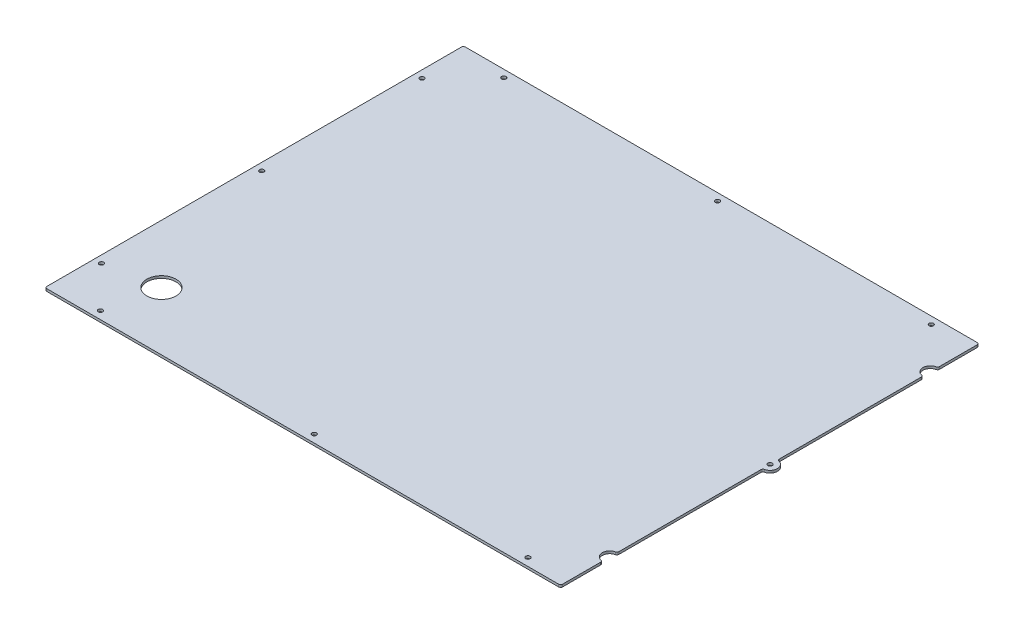
ISO-10303-21;
HEADER;
FILE_DESCRIPTION(('STEP AP214'),'2;1');
FILE_NAME('part.step','',(''),(''),'','','');
FILE_SCHEMA(('AUTOMOTIVE_DESIGN { 1 0 10303 214 1 1 1 1 }'));
ENDSEC;
DATA;
#1=APPLICATION_CONTEXT('core data for automotive mechanical design processes');
#2=APPLICATION_PROTOCOL_DEFINITION('international standard','automotive_design',2000,#1);
#3=PRODUCT_CONTEXT('',#1,'mechanical');
#4=PRODUCT('Part','Part','',(#3));
#5=PRODUCT_RELATED_PRODUCT_CATEGORY('part','',(#4));
#6=PRODUCT_DEFINITION_FORMATION('','',#4);
#7=PRODUCT_DEFINITION_CONTEXT('part definition',#1,'design');
#8=PRODUCT_DEFINITION('design','',#6,#7);
#9=PRODUCT_DEFINITION_SHAPE('','',#8);
#10=(LENGTH_UNIT() NAMED_UNIT(*) SI_UNIT(.MILLI.,.METRE.));
#11=(NAMED_UNIT(*) PLANE_ANGLE_UNIT() SI_UNIT($,.RADIAN.));
#12=(NAMED_UNIT(*) SI_UNIT($,.STERADIAN.) SOLID_ANGLE_UNIT());
#13=UNCERTAINTY_MEASURE_WITH_UNIT(LENGTH_MEASURE(1.E-05),#10,'distance_accuracy_value','');
#14=(GEOMETRIC_REPRESENTATION_CONTEXT(3) GLOBAL_UNCERTAINTY_ASSIGNED_CONTEXT((#13)) GLOBAL_UNIT_ASSIGNED_CONTEXT((#10,
#11,#12)) REPRESENTATION_CONTEXT('',''));
#15=CARTESIAN_POINT('',(0.,0.,0.));
#16=DIRECTION('',(0.,0.,1.));
#17=DIRECTION('',(1.,0.,0.));
#18=AXIS2_PLACEMENT_3D('',#15,#16,#17);
#19=CARTESIAN_POINT('',(-337.058,3.175,-273.558));
#20=DIRECTION('',(0.,0.,1.));
#21=DIRECTION('',(1.,0.,0.));
#22=AXIS2_PLACEMENT_3D('',#19,#20,#21);
#23=PLANE('',#22);
#24=DIRECTION('',(-1.,0.,0.));
#25=VECTOR('',#24,1.);
#26=CARTESIAN_POINT('',(-337.058,0.,-273.558));
#27=LINE('',#26,#25);
#28=CARTESIAN_POINT('',(334.518,0.,-273.558));
#29=VERTEX_POINT('',#28);
#30=CARTESIAN_POINT('',(-334.518,0.,-273.558));
#31=VERTEX_POINT('',#30);
#32=EDGE_CURVE('E200',#29,#31,#27,.T.);
#33=ORIENTED_EDGE('',*,*,#32,.T.);
#34=DIRECTION('',(0.,-1.,0.));
#35=VECTOR('',#34,1.);
#36=CARTESIAN_POINT('',(-334.518,3.175,-273.558));
#37=LINE('',#36,#35);
#38=CARTESIAN_POINT('',(-334.518,3.175,-273.558));
#39=VERTEX_POINT('',#38);
#40=EDGE_CURVE('E178',#31,#39,#37,.F.);
#41=ORIENTED_EDGE('',*,*,#40,.T.);
#42=DIRECTION('',(-1.,0.,0.));
#43=VECTOR('',#42,1.);
#44=CARTESIAN_POINT('',(-337.058,3.175,-273.558));
#45=LINE('',#44,#43);
#46=CARTESIAN_POINT('',(334.518,3.175,-273.558));
#47=VERTEX_POINT('',#46);
#48=EDGE_CURVE('E228',#47,#39,#45,.T.);
#49=ORIENTED_EDGE('',*,*,#48,.F.);
#50=DIRECTION('',(0.,-1.,0.));
#51=VECTOR('',#50,1.);
#52=CARTESIAN_POINT('',(334.518,3.175,-273.558));
#53=LINE('',#52,#51);
#54=EDGE_CURVE('E183',#47,#29,#53,.T.);
#55=ORIENTED_EDGE('',*,*,#54,.T.);
#56=EDGE_LOOP('',(#33,#41,#49,#55));
#57=FACE_BOUND('',#56,.T.);
#58=ADVANCED_FACE('F35',(#57),#23,.F.);
#59=CARTESIAN_POINT('',(-337.058,3.175,273.558));
#60=DIRECTION('',(1.,0.,0.));
#61=DIRECTION('',(0.,0.,-1.));
#62=AXIS2_PLACEMENT_3D('',#59,#60,#61);
#63=PLANE('',#62);
#64=DIRECTION('',(0.,0.,1.));
#65=VECTOR('',#64,1.);
#66=CARTESIAN_POINT('',(-337.058,3.175,273.558));
#67=LINE('',#66,#65);
#68=CARTESIAN_POINT('',(-337.058,3.175,-271.018));
#69=VERTEX_POINT('',#68);
#70=CARTESIAN_POINT('',(-337.058,3.175,271.018));
#71=VERTEX_POINT('',#70);
#72=EDGE_CURVE('E193',#69,#71,#67,.T.);
#73=ORIENTED_EDGE('',*,*,#72,.F.);
#74=DIRECTION('',(0.,-1.,0.));
#75=VECTOR('',#74,1.);
#76=CARTESIAN_POINT('',(-337.058,3.175,-271.018));
#77=LINE('',#76,#75);
#78=CARTESIAN_POINT('',(-337.058,0.,-271.018));
#79=VERTEX_POINT('',#78);
#80=EDGE_CURVE('E177',#69,#79,#77,.T.);
#81=ORIENTED_EDGE('',*,*,#80,.T.);
#82=DIRECTION('',(0.,0.,1.));
#83=VECTOR('',#82,1.);
#84=CARTESIAN_POINT('',(-337.058,0.,273.558));
#85=LINE('',#84,#83);
#86=CARTESIAN_POINT('',(-337.058,0.,271.018));
#87=VERTEX_POINT('',#86);
#88=EDGE_CURVE('E190',#79,#87,#85,.T.);
#89=ORIENTED_EDGE('',*,*,#88,.T.);
#90=DIRECTION('',(0.,-1.,0.));
#91=VECTOR('',#90,1.);
#92=CARTESIAN_POINT('',(-337.058,3.175,271.018));
#93=LINE('',#92,#91);
#94=EDGE_CURVE('E195',#87,#71,#93,.F.);
#95=ORIENTED_EDGE('',*,*,#94,.T.);
#96=EDGE_LOOP('',(#73,#81,#89,#95));
#97=FACE_BOUND('',#96,.T.);
#98=ADVANCED_FACE('F189',(#97),#63,.F.);
#99=CARTESIAN_POINT('',(-337.058,3.175,273.558));
#100=DIRECTION('',(0.,0.,-1.));
#101=DIRECTION('',(-1.,0.,0.));
#102=AXIS2_PLACEMENT_3D('',#99,#100,#101);
#103=PLANE('',#102);
#104=DIRECTION('',(1.,0.,0.));
#105=VECTOR('',#104,1.);
#106=CARTESIAN_POINT('',(-337.058,3.175,273.558));
#107=LINE('',#106,#105);
#108=CARTESIAN_POINT('',(-334.518,3.175,273.558));
#109=VERTEX_POINT('',#108);
#110=CARTESIAN_POINT('',(334.518,3.175,273.558));
#111=VERTEX_POINT('',#110);
#112=EDGE_CURVE('E403',#109,#111,#107,.T.);
#113=ORIENTED_EDGE('',*,*,#112,.F.);
#114=DIRECTION('',(0.,-1.,0.));
#115=VECTOR('',#114,1.);
#116=CARTESIAN_POINT('',(-334.518,3.175,273.558));
#117=LINE('',#116,#115);
#118=CARTESIAN_POINT('',(-334.518,0.,273.558));
#119=VERTEX_POINT('',#118);
#120=EDGE_CURVE('E263',#109,#119,#117,.T.);
#121=ORIENTED_EDGE('',*,*,#120,.T.);
#122=DIRECTION('',(1.,0.,0.));
#123=VECTOR('',#122,1.);
#124=CARTESIAN_POINT('',(-337.058,0.,273.558));
#125=LINE('',#124,#123);
#126=CARTESIAN_POINT('',(334.518,0.,273.558));
#127=VERTEX_POINT('',#126);
#128=EDGE_CURVE('E199',#119,#127,#125,.T.);
#129=ORIENTED_EDGE('',*,*,#128,.T.);
#130=DIRECTION('',(0.,-1.,0.));
#131=VECTOR('',#130,1.);
#132=CARTESIAN_POINT('',(334.518,3.175,273.558));
#133=LINE('',#132,#131);
#134=EDGE_CURVE('E261',#127,#111,#133,.F.);
#135=ORIENTED_EDGE('',*,*,#134,.T.);
#136=EDGE_LOOP('',(#113,#121,#129,#135));
#137=FACE_BOUND('',#136,.T.);
#138=ADVANCED_FACE('F362',(#137),#103,.F.);
#139=CARTESIAN_POINT('',(337.058,3.175,273.558));
#140=DIRECTION('',(-1.,0.,0.));
#141=DIRECTION('',(0.,0.,1.));
#142=AXIS2_PLACEMENT_3D('',#139,#140,#141);
#143=PLANE('',#142);
#144=DIRECTION('',(0.,0.,-1.));
#145=VECTOR('',#144,1.);
#146=CARTESIAN_POINT('',(337.058,3.175,273.558));
#147=LINE('',#146,#145);
#148=CARTESIAN_POINT('',(337.058,3.175,271.018));
#149=VERTEX_POINT('',#148);
#150=CARTESIAN_POINT('',(337.058,3.175,221.220481707814));
#151=VERTEX_POINT('',#150);
#152=EDGE_CURVE('E398',#149,#151,#147,.T.);
#153=ORIENTED_EDGE('',*,*,#152,.F.);
#154=DIRECTION('',(0.,-1.,0.));
#155=VECTOR('',#154,1.);
#156=CARTESIAN_POINT('',(337.058,3.175,271.018));
#157=LINE('',#156,#155);
#158=CARTESIAN_POINT('',(337.058,0.,271.018));
#159=VERTEX_POINT('',#158);
#160=EDGE_CURVE('E268',#149,#159,#157,.T.);
#161=ORIENTED_EDGE('',*,*,#160,.T.);
#162=DIRECTION('',(0.,0.,-1.));
#163=VECTOR('',#162,1.);
#164=CARTESIAN_POINT('',(337.058,0.,273.558));
#165=LINE('',#164,#163);
#166=CARTESIAN_POINT('',(337.058,0.,221.220481707814));
#167=VERTEX_POINT('',#166);
#168=EDGE_CURVE('E203',#159,#167,#165,.T.);
#169=ORIENTED_EDGE('',*,*,#168,.T.);
#170=DIRECTION('',(0.,-1.,0.));
#171=VECTOR('',#170,1.);
#172=CARTESIAN_POINT('',(337.058,3.175,221.220481707814));
#173=LINE('',#172,#171);
#174=EDGE_CURVE('E266',#167,#151,#173,.F.);
#175=ORIENTED_EDGE('',*,*,#174,.T.);
#176=EDGE_LOOP('',(#153,#161,#169,#175));
#177=FACE_BOUND('',#176,.T.);
#178=ADVANCED_FACE('F532',(#177),#143,.F.);
#179=CARTESIAN_POINT('',(337.058,3.175,209.296));
#180=DIRECTION('',(0.,-1.,0.));
#181=DIRECTION('',(0.,0.,-1.));
#182=AXIS2_PLACEMENT_3D('',#179,#180,#181);
#183=CYLINDRICAL_SURFACE('',#182,9.65199999999997);
#184=CARTESIAN_POINT('',(337.058,3.175,209.296));
#185=DIRECTION('',(0.,-1.,0.));
#186=DIRECTION('',(0.,0.,1.));
#187=AXIS2_PLACEMENT_3D('',#184,#185,#186);
#188=CIRCLE('',#187,9.65199999999997);
#189=CARTESIAN_POINT('',(335.047166666667,3.175,218.736214685353));
#190=VERTEX_POINT('',#189);
#191=CARTESIAN_POINT('',(335.047166666667,3.175,199.855785314647));
#192=VERTEX_POINT('',#191);
#193=EDGE_CURVE('E397',#190,#192,#188,.T.);
#194=ORIENTED_EDGE('',*,*,#193,.F.);
#195=DIRECTION('',(0.,-1.,0.));
#196=VECTOR('',#195,1.);
#197=CARTESIAN_POINT('',(335.047166666667,3.175,218.736214685353));
#198=LINE('',#197,#196);
#199=CARTESIAN_POINT('',(335.047166666667,0.,218.736214685353));
#200=VERTEX_POINT('',#199);
#201=EDGE_CURVE('E273',#190,#200,#198,.T.);
#202=ORIENTED_EDGE('',*,*,#201,.T.);
#203=CARTESIAN_POINT('',(337.058,0.,209.296));
#204=DIRECTION('',(0.,-1.,0.));
#205=DIRECTION('',(0.,0.,1.));
#206=AXIS2_PLACEMENT_3D('',#203,#204,#205);
#207=CIRCLE('',#206,9.65199999999997);
#208=CARTESIAN_POINT('',(335.047166666667,0.,199.855785314647));
#209=VERTEX_POINT('',#208);
#210=EDGE_CURVE('E211',#200,#209,#207,.T.);
#211=ORIENTED_EDGE('',*,*,#210,.T.);
#212=DIRECTION('',(0.,-1.,0.));
#213=VECTOR('',#212,1.);
#214=CARTESIAN_POINT('',(335.047166666667,3.175,199.855785314647));
#215=LINE('',#214,#213);
#216=EDGE_CURVE('E271',#209,#192,#215,.F.);
#217=ORIENTED_EDGE('',*,*,#216,.T.);
#218=EDGE_LOOP('',(#194,#202,#211,#217));
#219=FACE_BOUND('',#218,.T.);
#220=ADVANCED_FACE('F529',(#219),#183,.F.);
#221=CARTESIAN_POINT('',(337.058,3.175,199.644));
#222=DIRECTION('',(-1.,0.,0.));
#223=DIRECTION('',(0.,0.,1.));
#224=AXIS2_PLACEMENT_3D('',#221,#222,#223);
#225=PLANE('',#224);
#226=DIRECTION('',(0.,0.,-1.));
#227=VECTOR('',#226,1.);
#228=CARTESIAN_POINT('',(337.058,3.175,199.644));
#229=LINE('',#228,#227);
#230=CARTESIAN_POINT('',(337.058,3.175,197.371518292186));
#231=VERTEX_POINT('',#230);
#232=CARTESIAN_POINT('',(337.058,3.175,11.6704817078144));
#233=VERTEX_POINT('',#232);
#234=EDGE_CURVE('E328',#231,#233,#229,.T.);
#235=ORIENTED_EDGE('',*,*,#234,.F.);
#236=DIRECTION('',(0.,-1.,0.));
#237=VECTOR('',#236,1.);
#238=CARTESIAN_POINT('',(337.058,3.175,197.371518292186));
#239=LINE('',#238,#237);
#240=CARTESIAN_POINT('',(337.058,0.,197.371518292186));
#241=VERTEX_POINT('',#240);
#242=EDGE_CURVE('E278',#231,#241,#239,.T.);
#243=ORIENTED_EDGE('',*,*,#242,.T.);
#244=DIRECTION('',(0.,0.,-1.));
#245=VECTOR('',#244,1.);
#246=CARTESIAN_POINT('',(337.058,0.,199.644));
#247=LINE('',#246,#245);
#248=CARTESIAN_POINT('',(337.058,0.,11.6704817078144));
#249=VERTEX_POINT('',#248);
#250=EDGE_CURVE('E214',#241,#249,#247,.T.);
#251=ORIENTED_EDGE('',*,*,#250,.T.);
#252=DIRECTION('',(0.,1.,0.));
#253=VECTOR('',#252,1.);
#254=CARTESIAN_POINT('',(337.058,3.175,11.6704817078144));
#255=LINE('',#254,#253);
#256=EDGE_CURVE('E276',#249,#233,#255,.T.);
#257=ORIENTED_EDGE('',*,*,#256,.T.);
#258=EDGE_LOOP('',(#235,#243,#251,#257));
#259=FACE_BOUND('',#258,.T.);
#260=ADVANCED_FACE('F526',(#259),#225,.F.);
#261=CARTESIAN_POINT('',(337.058,3.175,-0.254000000000004));
#262=DIRECTION('',(0.,-1.,0.));
#263=DIRECTION('',(0.,0.,-1.));
#264=AXIS2_PLACEMENT_3D('',#261,#262,#263);
#265=CYLINDRICAL_SURFACE('',#264,9.65199999999998);
#266=CARTESIAN_POINT('',(337.058,3.175,-0.254000000000004));
#267=DIRECTION('',(0.,1.,0.));
#268=DIRECTION('',(0.,0.,1.));
#269=AXIS2_PLACEMENT_3D('',#266,#267,#268);
#270=CIRCLE('',#269,9.65199999999998);
#271=CARTESIAN_POINT('',(339.068833333333,3.175,9.18621468535305));
#272=VERTEX_POINT('',#271);
#273=CARTESIAN_POINT('',(339.068833333333,3.175,-9.69421468535305));
#274=VERTEX_POINT('',#273);
#275=EDGE_CURVE('E321',#272,#274,#270,.T.);
#276=ORIENTED_EDGE('',*,*,#275,.F.);
#277=DIRECTION('',(0.,-1.,0.));
#278=VECTOR('',#277,1.);
#279=CARTESIAN_POINT('',(339.068833333333,3.175,9.18621468535304));
#280=LINE('',#279,#278);
#281=CARTESIAN_POINT('',(339.068833333333,0.,9.18621468535305));
#282=VERTEX_POINT('',#281);
#283=EDGE_CURVE('E283',#272,#282,#280,.T.);
#284=ORIENTED_EDGE('',*,*,#283,.T.);
#285=CARTESIAN_POINT('',(337.058,0.,-0.254000000000004));
#286=DIRECTION('',(0.,1.,0.));
#287=DIRECTION('',(0.,0.,1.));
#288=AXIS2_PLACEMENT_3D('',#285,#286,#287);
#289=CIRCLE('',#288,9.65199999999998);
#290=CARTESIAN_POINT('',(339.068833333333,0.,-9.69421468535305));
#291=VERTEX_POINT('',#290);
#292=EDGE_CURVE('E217',#282,#291,#289,.T.);
#293=ORIENTED_EDGE('',*,*,#292,.T.);
#294=DIRECTION('',(0.,-1.,0.));
#295=VECTOR('',#294,1.);
#296=CARTESIAN_POINT('',(339.068833333333,3.175,-9.69421468535305));
#297=LINE('',#296,#295);
#298=EDGE_CURVE('E281',#291,#274,#297,.F.);
#299=ORIENTED_EDGE('',*,*,#298,.T.);
#300=EDGE_LOOP('',(#276,#284,#293,#299));
#301=FACE_BOUND('',#300,.T.);
#302=ADVANCED_FACE('F310',(#301),#265,.T.);
#303=CARTESIAN_POINT('',(337.058,3.175,-9.90599999999999));
#304=DIRECTION('',(-1.,0.,0.));
#305=DIRECTION('',(0.,0.,1.));
#306=AXIS2_PLACEMENT_3D('',#303,#304,#305);
#307=PLANE('',#306);
#308=DIRECTION('',(0.,0.,-1.));
#309=VECTOR('',#308,1.);
#310=CARTESIAN_POINT('',(337.058,3.175,-9.90599999999999));
#311=LINE('',#310,#309);
#312=CARTESIAN_POINT('',(337.058,3.175,-12.1784817078144));
#313=VERTEX_POINT('',#312);
#314=CARTESIAN_POINT('',(337.058,3.175,-197.879518292186));
#315=VERTEX_POINT('',#314);
#316=EDGE_CURVE('E319',#313,#315,#311,.T.);
#317=ORIENTED_EDGE('',*,*,#316,.F.);
#318=DIRECTION('',(0.,1.,0.));
#319=VECTOR('',#318,1.);
#320=CARTESIAN_POINT('',(337.058,0.,-12.1784817078144));
#321=LINE('',#320,#319);
#322=CARTESIAN_POINT('',(337.058,0.,-12.1784817078144));
#323=VERTEX_POINT('',#322);
#324=EDGE_CURVE('E288',#313,#323,#321,.F.);
#325=ORIENTED_EDGE('',*,*,#324,.T.);
#326=DIRECTION('',(0.,0.,-1.));
#327=VECTOR('',#326,1.);
#328=CARTESIAN_POINT('',(337.058,0.,-9.90599999999999));
#329=LINE('',#328,#327);
#330=CARTESIAN_POINT('',(337.058,0.,-197.879518292186));
#331=VERTEX_POINT('',#330);
#332=EDGE_CURVE('E220',#323,#331,#329,.T.);
#333=ORIENTED_EDGE('',*,*,#332,.T.);
#334=DIRECTION('',(0.,-1.,0.));
#335=VECTOR('',#334,1.);
#336=CARTESIAN_POINT('',(337.058,3.175,-197.879518292186));
#337=LINE('',#336,#335);
#338=EDGE_CURVE('E286',#331,#315,#337,.F.);
#339=ORIENTED_EDGE('',*,*,#338,.T.);
#340=EDGE_LOOP('',(#317,#325,#333,#339));
#341=FACE_BOUND('',#340,.T.);
#342=ADVANCED_FACE('F323',(#341),#307,.F.);
#343=CARTESIAN_POINT('',(337.058,3.175,-209.804));
#344=DIRECTION('',(0.,-1.,0.));
#345=DIRECTION('',(0.,0.,-1.));
#346=AXIS2_PLACEMENT_3D('',#343,#344,#345);
#347=CYLINDRICAL_SURFACE('',#346,9.65199999999997);
#348=CARTESIAN_POINT('',(337.058,3.175,-209.804));
#349=DIRECTION('',(0.,-1.,0.));
#350=DIRECTION('',(0.,0.,1.));
#351=AXIS2_PLACEMENT_3D('',#348,#349,#350);
#352=CIRCLE('',#351,9.65199999999997);
#353=CARTESIAN_POINT('',(335.047166666667,3.175,-200.363785314647));
#354=VERTEX_POINT('',#353);
#355=CARTESIAN_POINT('',(335.047166666667,3.175,-219.244214685353));
#356=VERTEX_POINT('',#355);
#357=EDGE_CURVE('E325',#354,#356,#352,.T.);
#358=ORIENTED_EDGE('',*,*,#357,.F.);
#359=DIRECTION('',(0.,-1.,0.));
#360=VECTOR('',#359,1.);
#361=CARTESIAN_POINT('',(335.047166666667,3.175,-200.363785314647));
#362=LINE('',#361,#360);
#363=CARTESIAN_POINT('',(335.047166666667,0.,-200.363785314647));
#364=VERTEX_POINT('',#363);
#365=EDGE_CURVE('E293',#354,#364,#362,.T.);
#366=ORIENTED_EDGE('',*,*,#365,.T.);
#367=CARTESIAN_POINT('',(337.058,0.,-209.804));
#368=DIRECTION('',(0.,-1.,0.));
#369=DIRECTION('',(0.,0.,1.));
#370=AXIS2_PLACEMENT_3D('',#367,#368,#369);
#371=CIRCLE('',#370,9.65199999999997);
#372=CARTESIAN_POINT('',(335.047166666667,0.,-219.244214685353));
#373=VERTEX_POINT('',#372);
#374=EDGE_CURVE('E223',#364,#373,#371,.T.);
#375=ORIENTED_EDGE('',*,*,#374,.T.);
#376=DIRECTION('',(0.,-1.,0.));
#377=VECTOR('',#376,1.);
#378=CARTESIAN_POINT('',(335.047166666667,3.175,-219.244214685353));
#379=LINE('',#378,#377);
#380=EDGE_CURVE('E291',#373,#356,#379,.F.);
#381=ORIENTED_EDGE('',*,*,#380,.T.);
#382=EDGE_LOOP('',(#358,#366,#375,#381));
#383=FACE_BOUND('',#382,.T.);
#384=ADVANCED_FACE('F345',(#383),#347,.F.);
#385=CARTESIAN_POINT('',(337.058,3.175,-219.456));
#386=DIRECTION('',(-1.,0.,0.));
#387=DIRECTION('',(0.,0.,1.));
#388=AXIS2_PLACEMENT_3D('',#385,#386,#387);
#389=PLANE('',#388);
#390=DIRECTION('',(0.,0.,-1.));
#391=VECTOR('',#390,1.);
#392=CARTESIAN_POINT('',(337.058,3.175,-219.456));
#393=LINE('',#392,#391);
#394=CARTESIAN_POINT('',(337.058,3.175,-221.728481707814));
#395=VERTEX_POINT('',#394);
#396=CARTESIAN_POINT('',(337.058,3.175,-271.018));
#397=VERTEX_POINT('',#396);
#398=EDGE_CURVE('E229',#395,#397,#393,.T.);
#399=ORIENTED_EDGE('',*,*,#398,.F.);
#400=DIRECTION('',(0.,-1.,0.));
#401=VECTOR('',#400,1.);
#402=CARTESIAN_POINT('',(337.058,3.175,-221.728481707814));
#403=LINE('',#402,#401);
#404=CARTESIAN_POINT('',(337.058,0.,-221.728481707814));
#405=VERTEX_POINT('',#404);
#406=EDGE_CURVE('E297',#395,#405,#403,.T.);
#407=ORIENTED_EDGE('',*,*,#406,.T.);
#408=DIRECTION('',(0.,0.,-1.));
#409=VECTOR('',#408,1.);
#410=CARTESIAN_POINT('',(337.058,0.,-219.456));
#411=LINE('',#410,#409);
#412=CARTESIAN_POINT('',(337.058,0.,-271.018));
#413=VERTEX_POINT('',#412);
#414=EDGE_CURVE('E226',#405,#413,#411,.T.);
#415=ORIENTED_EDGE('',*,*,#414,.T.);
#416=DIRECTION('',(0.,-1.,0.));
#417=VECTOR('',#416,1.);
#418=CARTESIAN_POINT('',(337.058,3.175,-271.018));
#419=LINE('',#418,#417);
#420=EDGE_CURVE('E50',#413,#397,#419,.F.);
#421=ORIENTED_EDGE('',*,*,#420,.T.);
#422=EDGE_LOOP('',(#399,#407,#415,#421));
#423=FACE_BOUND('',#422,.T.);
#424=ADVANCED_FACE('F338',(#423),#389,.F.);
#425=CARTESIAN_POINT('',(337.058,3.175,-209.804));
#426=DIRECTION('',(0.,1.,0.));
#427=DIRECTION('',(0.,0.,1.));
#428=AXIS2_PLACEMENT_3D('',#425,#426,#427);
#429=PLANE('',#428);
#430=CARTESIAN_POINT('',(-260.858,3.175,197.358));
#431=DIRECTION('',(0.,1.,0.));
#432=DIRECTION('',(0.,0.,1.));
#433=AXIS2_PLACEMENT_3D('',#430,#431,#432);
#434=CIRCLE('',#433,19.05);
#435=CARTESIAN_POINT('',(-260.858,3.175,216.408));
#436=VERTEX_POINT('',#435);
#437=EDGE_CURVE('E468',#436,#436,#434,.T.);
#438=ORIENTED_EDGE('',*,*,#437,.F.);
#439=EDGE_LOOP('',(#438));
#440=FACE_BOUND('',#439,.T.);
#441=CARTESIAN_POINT('',(284.226,3.175,-263.906));
#442=DIRECTION('',(0.,-1.,0.));
#443=DIRECTION('',(0.,0.,-1.));
#444=AXIS2_PLACEMENT_3D('',#441,#442,#443);
#445=CIRCLE('',#444,2.8956);
#446=CARTESIAN_POINT('',(284.226,3.175,-266.8016));
#447=VERTEX_POINT('',#446);
#448=EDGE_CURVE('E461',#447,#447,#445,.T.);
#449=ORIENTED_EDGE('',*,*,#448,.T.);
#450=EDGE_LOOP('',(#449));
#451=FACE_BOUND('',#450,.T.);
#452=CARTESIAN_POINT('',(4.82600000000016,3.175,-263.906));
#453=DIRECTION('',(0.,-1.,0.));
#454=DIRECTION('',(0.,0.,-1.));
#455=AXIS2_PLACEMENT_3D('',#452,#453,#454);
#456=CIRCLE('',#455,2.8956);
#457=CARTESIAN_POINT('',(4.82600000000016,3.175,-266.8016));
#458=VERTEX_POINT('',#457);
#459=EDGE_CURVE('E455',#458,#458,#456,.T.);
#460=ORIENTED_EDGE('',*,*,#459,.T.);
#461=EDGE_LOOP('',(#460));
#462=FACE_BOUND('',#461,.T.);
#463=CARTESIAN_POINT('',(-274.574,3.175,-263.906));
#464=DIRECTION('',(0.,-1.,0.));
#465=DIRECTION('',(0.,0.,-1.));
#466=AXIS2_PLACEMENT_3D('',#463,#464,#465);
#467=CIRCLE('',#466,2.8956);
#468=CARTESIAN_POINT('',(-274.574,3.175,-266.8016));
#469=VERTEX_POINT('',#468);
#470=EDGE_CURVE('E449',#469,#469,#467,.T.);
#471=ORIENTED_EDGE('',*,*,#470,.T.);
#472=EDGE_LOOP('',(#471));
#473=FACE_BOUND('',#472,.T.);
#474=CARTESIAN_POINT('',(-327.406,3.175,-209.804));
#475=DIRECTION('',(0.,-1.,0.));
#476=DIRECTION('',(0.,0.,-1.));
#477=AXIS2_PLACEMENT_3D('',#474,#475,#476);
#478=CIRCLE('',#477,2.8956);
#479=CARTESIAN_POINT('',(-327.406,3.175,-212.6996));
#480=VERTEX_POINT('',#479);
#481=EDGE_CURVE('E443',#480,#480,#478,.T.);
#482=ORIENTED_EDGE('',*,*,#481,.T.);
#483=EDGE_LOOP('',(#482));
#484=FACE_BOUND('',#483,.T.);
#485=CARTESIAN_POINT('',(-327.406,3.175,-0.253999999999865));
#486=DIRECTION('',(0.,-1.,0.));
#487=DIRECTION('',(0.,0.,-1.));
#488=AXIS2_PLACEMENT_3D('',#485,#486,#487);
#489=CIRCLE('',#488,2.8956);
#490=CARTESIAN_POINT('',(-327.406,3.175,-3.14959999999986));
#491=VERTEX_POINT('',#490);
#492=EDGE_CURVE('E437',#491,#491,#489,.T.);
#493=ORIENTED_EDGE('',*,*,#492,.T.);
#494=EDGE_LOOP('',(#493));
#495=FACE_BOUND('',#494,.T.);
#496=CARTESIAN_POINT('',(-327.406,3.175,209.296));
#497=DIRECTION('',(0.,-1.,0.));
#498=DIRECTION('',(0.,0.,-1.));
#499=AXIS2_PLACEMENT_3D('',#496,#497,#498);
#500=CIRCLE('',#499,2.8956);
#501=CARTESIAN_POINT('',(-327.406,3.175,206.4004));
#502=VERTEX_POINT('',#501);
#503=EDGE_CURVE('E431',#502,#502,#500,.T.);
#504=ORIENTED_EDGE('',*,*,#503,.T.);
#505=EDGE_LOOP('',(#504));
#506=FACE_BOUND('',#505,.T.);
#507=CARTESIAN_POINT('',(-274.574,3.175,263.398));
#508=DIRECTION('',(0.,-1.,0.));
#509=DIRECTION('',(0.,0.,-1.));
#510=AXIS2_PLACEMENT_3D('',#507,#508,#509);
#511=CIRCLE('',#510,2.8956);
#512=CARTESIAN_POINT('',(-274.574,3.175,260.5024));
#513=VERTEX_POINT('',#512);
#514=EDGE_CURVE('E425',#513,#513,#511,.T.);
#515=ORIENTED_EDGE('',*,*,#514,.T.);
#516=EDGE_LOOP('',(#515));
#517=FACE_BOUND('',#516,.T.);
#518=CARTESIAN_POINT('',(4.82600000000005,3.175,263.398));
#519=DIRECTION('',(0.,-1.,0.));
#520=DIRECTION('',(0.,0.,-1.));
#521=AXIS2_PLACEMENT_3D('',#518,#519,#520);
#522=CIRCLE('',#521,2.8956);
#523=CARTESIAN_POINT('',(4.82600000000005,3.175,260.5024));
#524=VERTEX_POINT('',#523);
#525=EDGE_CURVE('E419',#524,#524,#522,.T.);
#526=ORIENTED_EDGE('',*,*,#525,.T.);
#527=EDGE_LOOP('',(#526));
#528=FACE_BOUND('',#527,.T.);
#529=CARTESIAN_POINT('',(284.226,3.175,263.398));
#530=DIRECTION('',(0.,-1.,0.));
#531=DIRECTION('',(0.,0.,-1.));
#532=AXIS2_PLACEMENT_3D('',#529,#530,#531);
#533=CIRCLE('',#532,2.8956);
#534=CARTESIAN_POINT('',(284.226,3.175,260.5024));
#535=VERTEX_POINT('',#534);
#536=EDGE_CURVE('E413',#535,#535,#533,.T.);
#537=ORIENTED_EDGE('',*,*,#536,.T.);
#538=EDGE_LOOP('',(#537));
#539=FACE_BOUND('',#538,.T.);
#540=CARTESIAN_POINT('',(337.058,3.175,-0.254000000000004));
#541=DIRECTION('',(0.,1.,0.));
#542=DIRECTION('',(0.,0.,1.));
#543=AXIS2_PLACEMENT_3D('',#540,#541,#542);
#544=CIRCLE('',#543,2.8956);
#545=CARTESIAN_POINT('',(337.058,3.175,2.64159999999999));
#546=VERTEX_POINT('',#545);
#547=EDGE_CURVE('E410',#546,#546,#544,.T.);
#548=ORIENTED_EDGE('',*,*,#547,.F.);
#549=EDGE_LOOP('',(#548));
#550=FACE_BOUND('',#549,.T.);
#551=ORIENTED_EDGE('',*,*,#48,.T.);
#552=CARTESIAN_POINT('',(-334.518,3.175,-271.018));
#553=DIRECTION('',(0.,1.,0.));
#554=DIRECTION('',(0.,0.,1.));
#555=AXIS2_PLACEMENT_3D('',#552,#553,#554);
#556=CIRCLE('',#555,2.54);
#557=EDGE_CURVE('E259',#39,#69,#556,.T.);
#558=ORIENTED_EDGE('',*,*,#557,.T.);
#559=ORIENTED_EDGE('',*,*,#72,.T.);
#560=CARTESIAN_POINT('',(-334.518,3.175,271.018));
#561=DIRECTION('',(0.,1.,0.));
#562=DIRECTION('',(0.,0.,1.));
#563=AXIS2_PLACEMENT_3D('',#560,#561,#562);
#564=CIRCLE('',#563,2.54);
#565=EDGE_CURVE('E257',#71,#109,#564,.T.);
#566=ORIENTED_EDGE('',*,*,#565,.T.);
#567=ORIENTED_EDGE('',*,*,#112,.T.);
#568=CARTESIAN_POINT('',(334.518,3.175,271.018));
#569=DIRECTION('',(0.,1.,0.));
#570=DIRECTION('',(0.,0.,1.));
#571=AXIS2_PLACEMENT_3D('',#568,#569,#570);
#572=CIRCLE('',#571,2.54);
#573=EDGE_CURVE('E255',#111,#149,#572,.T.);
#574=ORIENTED_EDGE('',*,*,#573,.T.);
#575=ORIENTED_EDGE('',*,*,#152,.T.);
#576=CARTESIAN_POINT('',(334.518,3.175,221.220481707814));
#577=DIRECTION('',(0.,1.,0.));
#578=DIRECTION('',(0.,0.,1.));
#579=AXIS2_PLACEMENT_3D('',#576,#577,#578);
#580=CIRCLE('',#579,2.54);
#581=EDGE_CURVE('E253',#151,#190,#580,.T.);
#582=ORIENTED_EDGE('',*,*,#581,.T.);
#583=ORIENTED_EDGE('',*,*,#193,.T.);
#584=CARTESIAN_POINT('',(334.518,3.175,197.371518292186));
#585=DIRECTION('',(0.,1.,0.));
#586=DIRECTION('',(0.,0.,1.));
#587=AXIS2_PLACEMENT_3D('',#584,#585,#586);
#588=CIRCLE('',#587,2.54);
#589=EDGE_CURVE('E251',#192,#231,#588,.T.);
#590=ORIENTED_EDGE('',*,*,#589,.T.);
#591=ORIENTED_EDGE('',*,*,#234,.T.);
#592=CARTESIAN_POINT('',(339.598,3.175,11.6704817078144));
#593=DIRECTION('',(0.,1.,0.));
#594=DIRECTION('',(0.,0.,1.));
#595=AXIS2_PLACEMENT_3D('',#592,#593,#594);
#596=CIRCLE('',#595,2.54);
#597=EDGE_CURVE('E302',#233,#272,#596,.F.);
#598=ORIENTED_EDGE('',*,*,#597,.T.);
#599=ORIENTED_EDGE('',*,*,#275,.T.);
#600=CARTESIAN_POINT('',(339.598,3.175,-12.1784817078144));
#601=DIRECTION('',(0.,1.,0.));
#602=DIRECTION('',(0.,0.,1.));
#603=AXIS2_PLACEMENT_3D('',#600,#601,#602);
#604=CIRCLE('',#603,2.54);
#605=EDGE_CURVE('E11',#274,#313,#604,.F.);
#606=ORIENTED_EDGE('',*,*,#605,.T.);
#607=ORIENTED_EDGE('',*,*,#316,.T.);
#608=CARTESIAN_POINT('',(334.518,3.175,-197.879518292186));
#609=DIRECTION('',(0.,1.,0.));
#610=DIRECTION('',(0.,0.,1.));
#611=AXIS2_PLACEMENT_3D('',#608,#609,#610);
#612=CIRCLE('',#611,2.54);
#613=EDGE_CURVE('E249',#315,#354,#612,.T.);
#614=ORIENTED_EDGE('',*,*,#613,.T.);
#615=ORIENTED_EDGE('',*,*,#357,.T.);
#616=CARTESIAN_POINT('',(334.518,3.175,-221.728481707814));
#617=DIRECTION('',(0.,1.,0.));
#618=DIRECTION('',(0.,0.,1.));
#619=AXIS2_PLACEMENT_3D('',#616,#617,#618);
#620=CIRCLE('',#619,2.54);
#621=EDGE_CURVE('E57',#356,#395,#620,.T.);
#622=ORIENTED_EDGE('',*,*,#621,.T.);
#623=ORIENTED_EDGE('',*,*,#398,.T.);
#624=CARTESIAN_POINT('',(334.518,3.175,-271.018));
#625=DIRECTION('',(0.,1.,0.));
#626=DIRECTION('',(0.,0.,1.));
#627=AXIS2_PLACEMENT_3D('',#624,#625,#626);
#628=CIRCLE('',#627,2.54);
#629=EDGE_CURVE('E246',#397,#47,#628,.T.);
#630=ORIENTED_EDGE('',*,*,#629,.T.);
#631=EDGE_LOOP('',(#551,#558,#559,#566,#567,#574,#575,#582,#583,#590,#591,#598,#599,#606,#607,
#614,#615,#622,#623,#630));
#632=FACE_BOUND('',#631,.T.);
#633=ADVANCED_FACE('F318',(#440,#451,#462,#473,#484,#495,#506,#517,#528,#539,#550,#632),#429,.T.);
#634=CARTESIAN_POINT('',(337.058,0.,-209.804));
#635=DIRECTION('',(0.,1.,0.));
#636=DIRECTION('',(0.,0.,1.));
#637=AXIS2_PLACEMENT_3D('',#634,#635,#636);
#638=PLANE('',#637);
#639=CARTESIAN_POINT('',(-260.858,0.,197.358));
#640=DIRECTION('',(0.,1.,0.));
#641=DIRECTION('',(0.,0.,1.));
#642=AXIS2_PLACEMENT_3D('',#639,#640,#641);
#643=CIRCLE('',#642,19.05);
#644=CARTESIAN_POINT('',(-260.858,0.,216.408));
#645=VERTEX_POINT('',#644);
#646=EDGE_CURVE('E467',#645,#645,#643,.T.);
#647=ORIENTED_EDGE('',*,*,#646,.T.);
#648=EDGE_LOOP('',(#647));
#649=FACE_BOUND('',#648,.T.);
#650=CARTESIAN_POINT('',(284.226,0.,-263.906));
#651=DIRECTION('',(0.,-1.,0.));
#652=DIRECTION('',(0.,0.,-1.));
#653=AXIS2_PLACEMENT_3D('',#650,#651,#652);
#654=CIRCLE('',#653,2.8956);
#655=CARTESIAN_POINT('',(284.226,0.,-266.8016));
#656=VERTEX_POINT('',#655);
#657=EDGE_CURVE('E464',#656,#656,#654,.T.);
#658=ORIENTED_EDGE('',*,*,#657,.F.);
#659=EDGE_LOOP('',(#658));
#660=FACE_BOUND('',#659,.T.);
#661=CARTESIAN_POINT('',(4.82600000000016,0.,-263.906));
#662=DIRECTION('',(0.,-1.,0.));
#663=DIRECTION('',(0.,0.,-1.));
#664=AXIS2_PLACEMENT_3D('',#661,#662,#663);
#665=CIRCLE('',#664,2.89559999999999);
#666=CARTESIAN_POINT('',(4.82600000000016,0.,-266.8016));
#667=VERTEX_POINT('',#666);
#668=EDGE_CURVE('E458',#667,#667,#665,.T.);
#669=ORIENTED_EDGE('',*,*,#668,.F.);
#670=EDGE_LOOP('',(#669));
#671=FACE_BOUND('',#670,.T.);
#672=CARTESIAN_POINT('',(-274.574,0.,-263.906));
#673=DIRECTION('',(0.,-1.,0.));
#674=DIRECTION('',(0.,0.,-1.));
#675=AXIS2_PLACEMENT_3D('',#672,#673,#674);
#676=CIRCLE('',#675,2.8956);
#677=CARTESIAN_POINT('',(-274.574,0.,-266.8016));
#678=VERTEX_POINT('',#677);
#679=EDGE_CURVE('E452',#678,#678,#676,.T.);
#680=ORIENTED_EDGE('',*,*,#679,.F.);
#681=EDGE_LOOP('',(#680));
#682=FACE_BOUND('',#681,.T.);
#683=CARTESIAN_POINT('',(-327.406,0.,-209.804));
#684=DIRECTION('',(0.,-1.,0.));
#685=DIRECTION('',(0.,0.,-1.));
#686=AXIS2_PLACEMENT_3D('',#683,#684,#685);
#687=CIRCLE('',#686,2.8956);
#688=CARTESIAN_POINT('',(-327.406,0.,-212.6996));
#689=VERTEX_POINT('',#688);
#690=EDGE_CURVE('E446',#689,#689,#687,.T.);
#691=ORIENTED_EDGE('',*,*,#690,.F.);
#692=EDGE_LOOP('',(#691));
#693=FACE_BOUND('',#692,.T.);
#694=CARTESIAN_POINT('',(-327.406,0.,-0.253999999999865));
#695=DIRECTION('',(0.,-1.,0.));
#696=DIRECTION('',(0.,0.,-1.));
#697=AXIS2_PLACEMENT_3D('',#694,#695,#696);
#698=CIRCLE('',#697,2.8956);
#699=CARTESIAN_POINT('',(-327.406,0.,-3.14959999999986));
#700=VERTEX_POINT('',#699);
#701=EDGE_CURVE('E440',#700,#700,#698,.T.);
#702=ORIENTED_EDGE('',*,*,#701,.F.);
#703=EDGE_LOOP('',(#702));
#704=FACE_BOUND('',#703,.T.);
#705=CARTESIAN_POINT('',(-327.406,0.,209.296));
#706=DIRECTION('',(0.,-1.,0.));
#707=DIRECTION('',(0.,0.,-1.));
#708=AXIS2_PLACEMENT_3D('',#705,#706,#707);
#709=CIRCLE('',#708,2.8956);
#710=CARTESIAN_POINT('',(-327.406,0.,206.4004));
#711=VERTEX_POINT('',#710);
#712=EDGE_CURVE('E434',#711,#711,#709,.T.);
#713=ORIENTED_EDGE('',*,*,#712,.F.);
#714=EDGE_LOOP('',(#713));
#715=FACE_BOUND('',#714,.T.);
#716=CARTESIAN_POINT('',(-274.574,0.,263.398));
#717=DIRECTION('',(0.,-1.,0.));
#718=DIRECTION('',(0.,0.,-1.));
#719=AXIS2_PLACEMENT_3D('',#716,#717,#718);
#720=CIRCLE('',#719,2.8956);
#721=CARTESIAN_POINT('',(-274.574,0.,260.5024));
#722=VERTEX_POINT('',#721);
#723=EDGE_CURVE('E428',#722,#722,#720,.T.);
#724=ORIENTED_EDGE('',*,*,#723,.F.);
#725=EDGE_LOOP('',(#724));
#726=FACE_BOUND('',#725,.T.);
#727=CARTESIAN_POINT('',(4.82600000000005,0.,263.398));
#728=DIRECTION('',(0.,-1.,0.));
#729=DIRECTION('',(0.,0.,-1.));
#730=AXIS2_PLACEMENT_3D('',#727,#728,#729);
#731=CIRCLE('',#730,2.89559999999999);
#732=CARTESIAN_POINT('',(4.82600000000005,0.,260.5024));
#733=VERTEX_POINT('',#732);
#734=EDGE_CURVE('E422',#733,#733,#731,.T.);
#735=ORIENTED_EDGE('',*,*,#734,.F.);
#736=EDGE_LOOP('',(#735));
#737=FACE_BOUND('',#736,.T.);
#738=CARTESIAN_POINT('',(284.226,0.,263.398));
#739=DIRECTION('',(0.,-1.,0.));
#740=DIRECTION('',(0.,0.,-1.));
#741=AXIS2_PLACEMENT_3D('',#738,#739,#740);
#742=CIRCLE('',#741,2.8956);
#743=CARTESIAN_POINT('',(284.226,0.,260.5024));
#744=VERTEX_POINT('',#743);
#745=EDGE_CURVE('E416',#744,#744,#742,.T.);
#746=ORIENTED_EDGE('',*,*,#745,.F.);
#747=EDGE_LOOP('',(#746));
#748=FACE_BOUND('',#747,.T.);
#749=CARTESIAN_POINT('',(337.058,0.,-0.254000000000004));
#750=DIRECTION('',(0.,1.,0.));
#751=DIRECTION('',(0.,0.,1.));
#752=AXIS2_PLACEMENT_3D('',#749,#750,#751);
#753=CIRCLE('',#752,2.8956);
#754=CARTESIAN_POINT('',(337.058,0.,2.64159999999999));
#755=VERTEX_POINT('',#754);
#756=EDGE_CURVE('E205',#755,#755,#753,.T.);
#757=ORIENTED_EDGE('',*,*,#756,.T.);
#758=EDGE_LOOP('',(#757));
#759=FACE_BOUND('',#758,.T.);
#760=ORIENTED_EDGE('',*,*,#88,.F.);
#761=CARTESIAN_POINT('',(-334.518,0.,-271.018));
#762=DIRECTION('',(0.,1.,0.));
#763=DIRECTION('',(0.,0.,1.));
#764=AXIS2_PLACEMENT_3D('',#761,#762,#763);
#765=CIRCLE('',#764,2.54);
#766=EDGE_CURVE('E173',#79,#31,#765,.F.);
#767=ORIENTED_EDGE('',*,*,#766,.T.);
#768=ORIENTED_EDGE('',*,*,#32,.F.);
#769=CARTESIAN_POINT('',(334.518,0.,-271.018));
#770=DIRECTION('',(0.,1.,0.));
#771=DIRECTION('',(0.,0.,1.));
#772=AXIS2_PLACEMENT_3D('',#769,#770,#771);
#773=CIRCLE('',#772,2.54);
#774=EDGE_CURVE('E194',#29,#413,#773,.F.);
#775=ORIENTED_EDGE('',*,*,#774,.T.);
#776=ORIENTED_EDGE('',*,*,#414,.F.);
#777=CARTESIAN_POINT('',(334.518,0.,-221.728481707814));
#778=DIRECTION('',(0.,1.,0.));
#779=DIRECTION('',(0.,0.,1.));
#780=AXIS2_PLACEMENT_3D('',#777,#778,#779);
#781=CIRCLE('',#780,2.54);
#782=EDGE_CURVE('E232',#405,#373,#781,.F.);
#783=ORIENTED_EDGE('',*,*,#782,.T.);
#784=ORIENTED_EDGE('',*,*,#374,.F.);
#785=CARTESIAN_POINT('',(334.518,0.,-197.879518292186));
#786=DIRECTION('',(0.,1.,0.));
#787=DIRECTION('',(0.,0.,1.));
#788=AXIS2_PLACEMENT_3D('',#785,#786,#787);
#789=CIRCLE('',#788,2.54);
#790=EDGE_CURVE('E234',#364,#331,#789,.F.);
#791=ORIENTED_EDGE('',*,*,#790,.T.);
#792=ORIENTED_EDGE('',*,*,#332,.F.);
#793=CARTESIAN_POINT('',(339.598,0.,-12.1784817078144));
#794=DIRECTION('',(0.,1.,0.));
#795=DIRECTION('',(0.,0.,1.));
#796=AXIS2_PLACEMENT_3D('',#793,#794,#795);
#797=CIRCLE('',#796,2.54);
#798=EDGE_CURVE('E43',#323,#291,#797,.T.);
#799=ORIENTED_EDGE('',*,*,#798,.T.);
#800=ORIENTED_EDGE('',*,*,#292,.F.);
#801=CARTESIAN_POINT('',(339.598,0.,11.6704817078144));
#802=DIRECTION('',(0.,1.,0.));
#803=DIRECTION('',(0.,0.,1.));
#804=AXIS2_PLACEMENT_3D('',#801,#802,#803);
#805=CIRCLE('',#804,2.54);
#806=EDGE_CURVE('E300',#282,#249,#805,.T.);
#807=ORIENTED_EDGE('',*,*,#806,.T.);
#808=ORIENTED_EDGE('',*,*,#250,.F.);
#809=CARTESIAN_POINT('',(334.518,0.,197.371518292186));
#810=DIRECTION('',(0.,1.,0.));
#811=DIRECTION('',(0.,0.,1.));
#812=AXIS2_PLACEMENT_3D('',#809,#810,#811);
#813=CIRCLE('',#812,2.54);
#814=EDGE_CURVE('E236',#241,#209,#813,.F.);
#815=ORIENTED_EDGE('',*,*,#814,.T.);
#816=ORIENTED_EDGE('',*,*,#210,.F.);
#817=CARTESIAN_POINT('',(334.518,0.,221.220481707814));
#818=DIRECTION('',(0.,1.,0.));
#819=DIRECTION('',(0.,0.,1.));
#820=AXIS2_PLACEMENT_3D('',#817,#818,#819);
#821=CIRCLE('',#820,2.54);
#822=EDGE_CURVE('E238',#200,#167,#821,.F.);
#823=ORIENTED_EDGE('',*,*,#822,.T.);
#824=ORIENTED_EDGE('',*,*,#168,.F.);
#825=CARTESIAN_POINT('',(334.518,0.,271.018));
#826=DIRECTION('',(0.,1.,0.));
#827=DIRECTION('',(0.,0.,1.));
#828=AXIS2_PLACEMENT_3D('',#825,#826,#827);
#829=CIRCLE('',#828,2.54);
#830=EDGE_CURVE('E240',#159,#127,#829,.F.);
#831=ORIENTED_EDGE('',*,*,#830,.T.);
#832=ORIENTED_EDGE('',*,*,#128,.F.);
#833=CARTESIAN_POINT('',(-334.518,0.,271.018));
#834=DIRECTION('',(0.,1.,0.));
#835=DIRECTION('',(0.,0.,1.));
#836=AXIS2_PLACEMENT_3D('',#833,#834,#835);
#837=CIRCLE('',#836,2.54);
#838=EDGE_CURVE('E184',#119,#87,#837,.F.);
#839=ORIENTED_EDGE('',*,*,#838,.T.);
#840=EDGE_LOOP('',(#760,#767,#768,#775,#776,#783,#784,#791,#792,#799,#800,#807,#808,#815,#816,
#823,#824,#831,#832,#839));
#841=FACE_BOUND('',#840,.T.);
#842=ADVANCED_FACE('F197',(#649,#660,#671,#682,#693,#704,#715,#726,#737,#748,#759,#841),#638,.F.);
#843=CARTESIAN_POINT('',(337.058,3.175,-0.254000000000004));
#844=DIRECTION('',(0.,1.,0.));
#845=DIRECTION('',(0.,0.,1.));
#846=AXIS2_PLACEMENT_3D('',#843,#844,#845);
#847=CYLINDRICAL_SURFACE('',#846,2.8956);
#848=ORIENTED_EDGE('',*,*,#756,.F.);
#849=EDGE_LOOP('',(#848));
#850=FACE_BOUND('',#849,.T.);
#851=ORIENTED_EDGE('',*,*,#547,.T.);
#852=EDGE_LOOP('',(#851));
#853=FACE_BOUND('',#852,.T.);
#854=ADVANCED_FACE('F369',(#850,#853),#847,.F.);
#855=CARTESIAN_POINT('',(-334.518,3.175,-271.018));
#856=DIRECTION('',(0.,-1.,0.));
#857=DIRECTION('',(0.,0.,-1.));
#858=AXIS2_PLACEMENT_3D('',#855,#856,#857);
#859=CYLINDRICAL_SURFACE('',#858,2.54);
#860=ORIENTED_EDGE('',*,*,#557,.F.);
#861=ORIENTED_EDGE('',*,*,#40,.F.);
#862=ORIENTED_EDGE('',*,*,#766,.F.);
#863=ORIENTED_EDGE('',*,*,#80,.F.);
#864=EDGE_LOOP('',(#860,#861,#862,#863));
#865=FACE_BOUND('',#864,.T.);
#866=ADVANCED_FACE('F176',(#865),#859,.T.);
#867=CARTESIAN_POINT('',(-334.518,3.175,271.018));
#868=DIRECTION('',(0.,-1.,0.));
#869=DIRECTION('',(0.,0.,-1.));
#870=AXIS2_PLACEMENT_3D('',#867,#868,#869);
#871=CYLINDRICAL_SURFACE('',#870,2.54);
#872=ORIENTED_EDGE('',*,*,#565,.F.);
#873=ORIENTED_EDGE('',*,*,#94,.F.);
#874=ORIENTED_EDGE('',*,*,#838,.F.);
#875=ORIENTED_EDGE('',*,*,#120,.F.);
#876=EDGE_LOOP('',(#872,#873,#874,#875));
#877=FACE_BOUND('',#876,.T.);
#878=ADVANCED_FACE('F368',(#877),#871,.T.);
#879=CARTESIAN_POINT('',(334.518,3.175,271.018));
#880=DIRECTION('',(0.,-1.,0.));
#881=DIRECTION('',(0.,0.,-1.));
#882=AXIS2_PLACEMENT_3D('',#879,#880,#881);
#883=CYLINDRICAL_SURFACE('',#882,2.54);
#884=ORIENTED_EDGE('',*,*,#573,.F.);
#885=ORIENTED_EDGE('',*,*,#134,.F.);
#886=ORIENTED_EDGE('',*,*,#830,.F.);
#887=ORIENTED_EDGE('',*,*,#160,.F.);
#888=EDGE_LOOP('',(#884,#885,#886,#887));
#889=FACE_BOUND('',#888,.T.);
#890=ADVANCED_FACE('F372',(#889),#883,.T.);
#891=CARTESIAN_POINT('',(334.518,3.175,221.220481707814));
#892=DIRECTION('',(0.,-1.,0.));
#893=DIRECTION('',(0.,0.,-1.));
#894=AXIS2_PLACEMENT_3D('',#891,#892,#893);
#895=CYLINDRICAL_SURFACE('',#894,2.54);
#896=ORIENTED_EDGE('',*,*,#581,.F.);
#897=ORIENTED_EDGE('',*,*,#174,.F.);
#898=ORIENTED_EDGE('',*,*,#822,.F.);
#899=ORIENTED_EDGE('',*,*,#201,.F.);
#900=EDGE_LOOP('',(#896,#897,#898,#899));
#901=FACE_BOUND('',#900,.T.);
#902=ADVANCED_FACE('F376',(#901),#895,.T.);
#903=CARTESIAN_POINT('',(334.518,3.175,197.371518292186));
#904=DIRECTION('',(0.,-1.,0.));
#905=DIRECTION('',(0.,0.,-1.));
#906=AXIS2_PLACEMENT_3D('',#903,#904,#905);
#907=CYLINDRICAL_SURFACE('',#906,2.54);
#908=ORIENTED_EDGE('',*,*,#589,.F.);
#909=ORIENTED_EDGE('',*,*,#216,.F.);
#910=ORIENTED_EDGE('',*,*,#814,.F.);
#911=ORIENTED_EDGE('',*,*,#242,.F.);
#912=EDGE_LOOP('',(#908,#909,#910,#911));
#913=FACE_BOUND('',#912,.T.);
#914=ADVANCED_FACE('F380',(#913),#907,.T.);
#915=CARTESIAN_POINT('',(339.598,3.175,11.6704817078144));
#916=DIRECTION('',(0.,-1.,0.));
#917=DIRECTION('',(0.,0.,-1.));
#918=AXIS2_PLACEMENT_3D('',#915,#916,#917);
#919=CYLINDRICAL_SURFACE('',#918,2.54);
#920=ORIENTED_EDGE('',*,*,#597,.F.);
#921=ORIENTED_EDGE('',*,*,#256,.F.);
#922=ORIENTED_EDGE('',*,*,#806,.F.);
#923=ORIENTED_EDGE('',*,*,#283,.F.);
#924=EDGE_LOOP('',(#920,#921,#922,#923));
#925=FACE_BOUND('',#924,.T.);
#926=ADVANCED_FACE('F355',(#925),#919,.F.);
#927=CARTESIAN_POINT('',(339.598,3.175,-12.1784817078144));
#928=DIRECTION('',(0.,-1.,0.));
#929=DIRECTION('',(0.,0.,-1.));
#930=AXIS2_PLACEMENT_3D('',#927,#928,#929);
#931=CYLINDRICAL_SURFACE('',#930,2.54);
#932=ORIENTED_EDGE('',*,*,#605,.F.);
#933=ORIENTED_EDGE('',*,*,#298,.F.);
#934=ORIENTED_EDGE('',*,*,#798,.F.);
#935=ORIENTED_EDGE('',*,*,#324,.F.);
#936=EDGE_LOOP('',(#932,#933,#934,#935));
#937=FACE_BOUND('',#936,.T.);
#938=ADVANCED_FACE('F314',(#937),#931,.F.);
#939=CARTESIAN_POINT('',(334.518,3.175,-197.879518292186));
#940=DIRECTION('',(0.,-1.,0.));
#941=DIRECTION('',(0.,0.,-1.));
#942=AXIS2_PLACEMENT_3D('',#939,#940,#941);
#943=CYLINDRICAL_SURFACE('',#942,2.54);
#944=ORIENTED_EDGE('',*,*,#613,.F.);
#945=ORIENTED_EDGE('',*,*,#338,.F.);
#946=ORIENTED_EDGE('',*,*,#790,.F.);
#947=ORIENTED_EDGE('',*,*,#365,.F.);
#948=EDGE_LOOP('',(#944,#945,#946,#947));
#949=FACE_BOUND('',#948,.T.);
#950=ADVANCED_FACE('F348',(#949),#943,.T.);
#951=CARTESIAN_POINT('',(334.518,3.175,-221.728481707814));
#952=DIRECTION('',(0.,-1.,0.));
#953=DIRECTION('',(0.,0.,-1.));
#954=AXIS2_PLACEMENT_3D('',#951,#952,#953);
#955=CYLINDRICAL_SURFACE('',#954,2.54);
#956=ORIENTED_EDGE('',*,*,#621,.F.);
#957=ORIENTED_EDGE('',*,*,#380,.F.);
#958=ORIENTED_EDGE('',*,*,#782,.F.);
#959=ORIENTED_EDGE('',*,*,#406,.F.);
#960=EDGE_LOOP('',(#956,#957,#958,#959));
#961=FACE_BOUND('',#960,.T.);
#962=ADVANCED_FACE('F340',(#961),#955,.T.);
#963=CARTESIAN_POINT('',(334.518,3.175,-271.018));
#964=DIRECTION('',(0.,-1.,0.));
#965=DIRECTION('',(0.,0.,-1.));
#966=AXIS2_PLACEMENT_3D('',#963,#964,#965);
#967=CYLINDRICAL_SURFACE('',#966,2.54);
#968=ORIENTED_EDGE('',*,*,#629,.F.);
#969=ORIENTED_EDGE('',*,*,#420,.F.);
#970=ORIENTED_EDGE('',*,*,#774,.F.);
#971=ORIENTED_EDGE('',*,*,#54,.F.);
#972=EDGE_LOOP('',(#968,#969,#970,#971));
#973=FACE_BOUND('',#972,.T.);
#974=ADVANCED_FACE('F37',(#973),#967,.T.);
#975=CARTESIAN_POINT('',(284.226,0.,263.398));
#976=DIRECTION('',(0.,-1.,0.));
#977=DIRECTION('',(0.,0.,-1.));
#978=AXIS2_PLACEMENT_3D('',#975,#976,#977);
#979=CYLINDRICAL_SURFACE('',#978,2.8956);
#980=ORIENTED_EDGE('',*,*,#536,.F.);
#981=EDGE_LOOP('',(#980));
#982=FACE_BOUND('',#981,.T.);
#983=ORIENTED_EDGE('',*,*,#745,.T.);
#984=EDGE_LOOP('',(#983));
#985=FACE_BOUND('',#984,.T.);
#986=ADVANCED_FACE('F515',(#982,#985),#979,.F.);
#987=CARTESIAN_POINT('',(4.82600000000005,0.,263.398));
#988=DIRECTION('',(0.,-1.,0.));
#989=DIRECTION('',(0.,0.,-1.));
#990=AXIS2_PLACEMENT_3D('',#987,#988,#989);
#991=CYLINDRICAL_SURFACE('',#990,2.89559999999999);
#992=ORIENTED_EDGE('',*,*,#525,.F.);
#993=EDGE_LOOP('',(#992));
#994=FACE_BOUND('',#993,.T.);
#995=ORIENTED_EDGE('',*,*,#734,.T.);
#996=EDGE_LOOP('',(#995));
#997=FACE_BOUND('',#996,.T.);
#998=ADVANCED_FACE('F661',(#994,#997),#991,.F.);
#999=CARTESIAN_POINT('',(-274.574,0.,263.398));
#1000=DIRECTION('',(0.,-1.,0.));
#1001=DIRECTION('',(0.,0.,-1.));
#1002=AXIS2_PLACEMENT_3D('',#999,#1000,#1001);
#1003=CYLINDRICAL_SURFACE('',#1002,2.8956);
#1004=ORIENTED_EDGE('',*,*,#514,.F.);
#1005=EDGE_LOOP('',(#1004));
#1006=FACE_BOUND('',#1005,.T.);
#1007=ORIENTED_EDGE('',*,*,#723,.T.);
#1008=EDGE_LOOP('',(#1007));
#1009=FACE_BOUND('',#1008,.T.);
#1010=ADVANCED_FACE('F653',(#1006,#1009),#1003,.F.);
#1011=CARTESIAN_POINT('',(-327.406,0.,209.296));
#1012=DIRECTION('',(0.,-1.,0.));
#1013=DIRECTION('',(0.,0.,-1.));
#1014=AXIS2_PLACEMENT_3D('',#1011,#1012,#1013);
#1015=CYLINDRICAL_SURFACE('',#1014,2.8956);
#1016=ORIENTED_EDGE('',*,*,#503,.F.);
#1017=EDGE_LOOP('',(#1016));
#1018=FACE_BOUND('',#1017,.T.);
#1019=ORIENTED_EDGE('',*,*,#712,.T.);
#1020=EDGE_LOOP('',(#1019));
#1021=FACE_BOUND('',#1020,.T.);
#1022=ADVANCED_FACE('F645',(#1018,#1021),#1015,.F.);
#1023=CARTESIAN_POINT('',(-327.406,0.,-0.253999999999865));
#1024=DIRECTION('',(0.,-1.,0.));
#1025=DIRECTION('',(0.,0.,-1.));
#1026=AXIS2_PLACEMENT_3D('',#1023,#1024,#1025);
#1027=CYLINDRICAL_SURFACE('',#1026,2.8956);
#1028=ORIENTED_EDGE('',*,*,#492,.F.);
#1029=EDGE_LOOP('',(#1028));
#1030=FACE_BOUND('',#1029,.T.);
#1031=ORIENTED_EDGE('',*,*,#701,.T.);
#1032=EDGE_LOOP('',(#1031));
#1033=FACE_BOUND('',#1032,.T.);
#1034=ADVANCED_FACE('F637',(#1030,#1033),#1027,.F.);
#1035=CARTESIAN_POINT('',(-327.406,0.,-209.804));
#1036=DIRECTION('',(0.,-1.,0.));
#1037=DIRECTION('',(0.,0.,-1.));
#1038=AXIS2_PLACEMENT_3D('',#1035,#1036,#1037);
#1039=CYLINDRICAL_SURFACE('',#1038,2.8956);
#1040=ORIENTED_EDGE('',*,*,#481,.F.);
#1041=EDGE_LOOP('',(#1040));
#1042=FACE_BOUND('',#1041,.T.);
#1043=ORIENTED_EDGE('',*,*,#690,.T.);
#1044=EDGE_LOOP('',(#1043));
#1045=FACE_BOUND('',#1044,.T.);
#1046=ADVANCED_FACE('F629',(#1042,#1045),#1039,.F.);
#1047=CARTESIAN_POINT('',(-274.574,0.,-263.906));
#1048=DIRECTION('',(0.,-1.,0.));
#1049=DIRECTION('',(0.,0.,-1.));
#1050=AXIS2_PLACEMENT_3D('',#1047,#1048,#1049);
#1051=CYLINDRICAL_SURFACE('',#1050,2.8956);
#1052=ORIENTED_EDGE('',*,*,#470,.F.);
#1053=EDGE_LOOP('',(#1052));
#1054=FACE_BOUND('',#1053,.T.);
#1055=ORIENTED_EDGE('',*,*,#679,.T.);
#1056=EDGE_LOOP('',(#1055));
#1057=FACE_BOUND('',#1056,.T.);
#1058=ADVANCED_FACE('F621',(#1054,#1057),#1051,.F.);
#1059=CARTESIAN_POINT('',(4.82600000000016,0.,-263.906));
#1060=DIRECTION('',(0.,-1.,0.));
#1061=DIRECTION('',(0.,0.,-1.));
#1062=AXIS2_PLACEMENT_3D('',#1059,#1060,#1061);
#1063=CYLINDRICAL_SURFACE('',#1062,2.89559999999999);
#1064=ORIENTED_EDGE('',*,*,#459,.F.);
#1065=EDGE_LOOP('',(#1064));
#1066=FACE_BOUND('',#1065,.T.);
#1067=ORIENTED_EDGE('',*,*,#668,.T.);
#1068=EDGE_LOOP('',(#1067));
#1069=FACE_BOUND('',#1068,.T.);
#1070=ADVANCED_FACE('F614',(#1066,#1069),#1063,.F.);
#1071=CARTESIAN_POINT('',(284.226,0.,-263.906));
#1072=DIRECTION('',(0.,-1.,0.));
#1073=DIRECTION('',(0.,0.,-1.));
#1074=AXIS2_PLACEMENT_3D('',#1071,#1072,#1073);
#1075=CYLINDRICAL_SURFACE('',#1074,2.8956);
#1076=ORIENTED_EDGE('',*,*,#448,.F.);
#1077=EDGE_LOOP('',(#1076));
#1078=FACE_BOUND('',#1077,.T.);
#1079=ORIENTED_EDGE('',*,*,#657,.T.);
#1080=EDGE_LOOP('',(#1079));
#1081=FACE_BOUND('',#1080,.T.);
#1082=ADVANCED_FACE('F479',(#1078,#1081),#1075,.F.);
#1083=CARTESIAN_POINT('',(-260.858,0.,197.358));
#1084=DIRECTION('',(0.,1.,0.));
#1085=DIRECTION('',(0.,0.,1.));
#1086=AXIS2_PLACEMENT_3D('',#1083,#1084,#1085);
#1087=CYLINDRICAL_SURFACE('',#1086,19.05);
#1088=ORIENTED_EDGE('',*,*,#646,.F.);
#1089=EDGE_LOOP('',(#1088));
#1090=FACE_BOUND('',#1089,.T.);
#1091=ORIENTED_EDGE('',*,*,#437,.T.);
#1092=EDGE_LOOP('',(#1091));
#1093=FACE_BOUND('',#1092,.T.);
#1094=ADVANCED_FACE('F476',(#1090,#1093),#1087,.F.);
#1095=CLOSED_SHELL('',(#58,#98,#138,#178,#220,#260,#302,#342,#384,#424,#633,#842,#854,#866,#878,
#890,#902,#914,#926,#938,#950,#962,#974,#986,#998,#1010,#1022,#1034,#1046,#1058,#1070,#1082,#1094));
#1096=MANIFOLD_SOLID_BREP('B2',#1095);
#1097=ADVANCED_BREP_SHAPE_REPRESENTATION('',(#18,#1096),#14);
#1098=SHAPE_DEFINITION_REPRESENTATION(#9,#1097);
ENDSEC;
END-ISO-10303-21;
